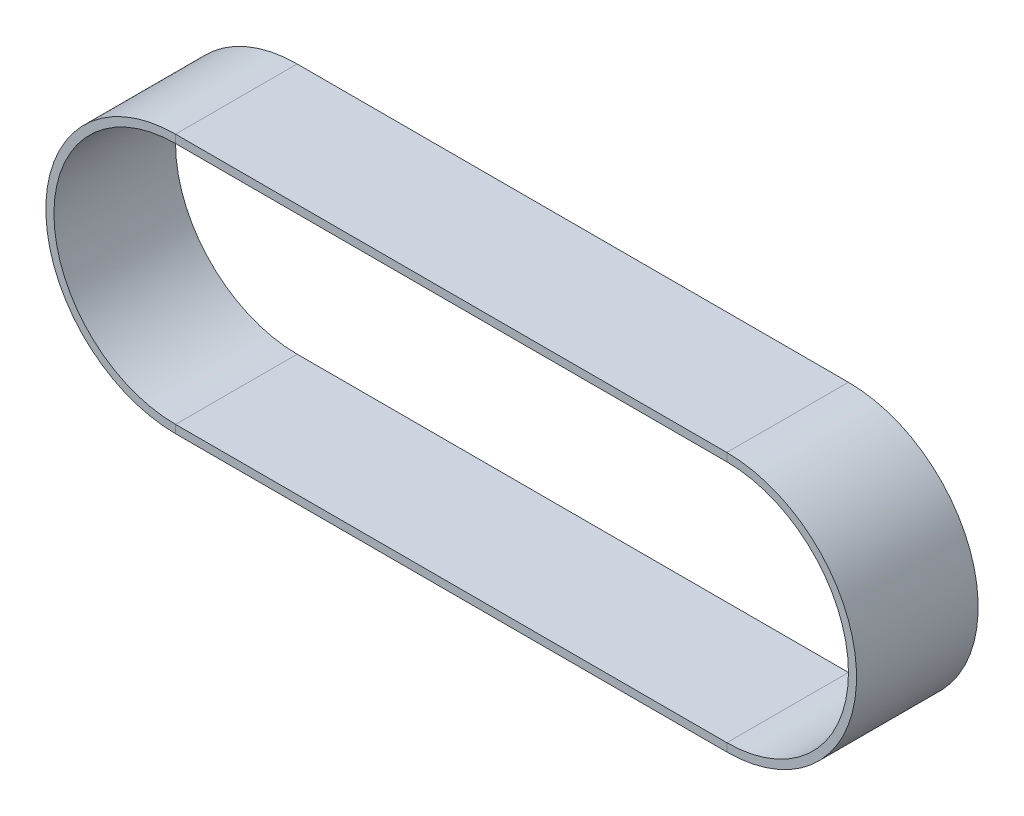
ISO-10303-21;
HEADER;
FILE_DESCRIPTION(('STEP AP214'),'2;1');
FILE_NAME('part.step','',(''),(''),'','','');
FILE_SCHEMA(('AUTOMOTIVE_DESIGN { 1 0 10303 214 1 1 1 1 }'));
ENDSEC;
DATA;
#1=APPLICATION_CONTEXT('core data for automotive mechanical design processes');
#2=APPLICATION_PROTOCOL_DEFINITION('international standard','automotive_design',2000,#1);
#3=PRODUCT_CONTEXT('',#1,'mechanical');
#4=PRODUCT('Part','Part','',(#3));
#5=PRODUCT_RELATED_PRODUCT_CATEGORY('part','',(#4));
#6=PRODUCT_DEFINITION_FORMATION('','',#4);
#7=PRODUCT_DEFINITION_CONTEXT('part definition',#1,'design');
#8=PRODUCT_DEFINITION('design','',#6,#7);
#9=PRODUCT_DEFINITION_SHAPE('','',#8);
#10=(LENGTH_UNIT() NAMED_UNIT(*) SI_UNIT(.MILLI.,.METRE.));
#11=(NAMED_UNIT(*) PLANE_ANGLE_UNIT() SI_UNIT($,.RADIAN.));
#12=(NAMED_UNIT(*) SI_UNIT($,.STERADIAN.) SOLID_ANGLE_UNIT());
#13=UNCERTAINTY_MEASURE_WITH_UNIT(LENGTH_MEASURE(1.E-05),#10,'distance_accuracy_value','');
#14=(GEOMETRIC_REPRESENTATION_CONTEXT(3) GLOBAL_UNCERTAINTY_ASSIGNED_CONTEXT((#13)) GLOBAL_UNIT_ASSIGNED_CONTEXT((#10,
#11,#12)) REPRESENTATION_CONTEXT('',''));
#15=CARTESIAN_POINT('',(0.,0.,0.));
#16=DIRECTION('',(0.,0.,1.));
#17=DIRECTION('',(1.,0.,0.));
#18=AXIS2_PLACEMENT_3D('',#15,#16,#17);
#19=CARTESIAN_POINT('',(-1360.,320.,150.));
#20=DIRECTION('',(0.,1.,0.));
#21=DIRECTION('',(0.,0.,1.));
#22=AXIS2_PLACEMENT_3D('',#19,#20,#21);
#23=PLANE('',#22);
#24=DIRECTION('',(1.,0.,0.));
#25=VECTOR('',#24,1.);
#26=CARTESIAN_POINT('',(-1360.,320.,-150.));
#27=LINE('',#26,#25);
#28=CARTESIAN_POINT('',(-1360.,320.,-150.));
#29=VERTEX_POINT('',#28);
#30=CARTESIAN_POINT('',(0.,320.,-150.));
#31=VERTEX_POINT('',#30);
#32=EDGE_CURVE('E11',#29,#31,#27,.T.);
#33=ORIENTED_EDGE('',*,*,#32,.F.);
#34=DIRECTION('',(0.,0.,1.));
#35=VECTOR('',#34,1.);
#36=CARTESIAN_POINT('',(-1360.,320.,150.));
#37=LINE('',#36,#35);
#38=CARTESIAN_POINT('',(-1360.,320.,150.));
#39=VERTEX_POINT('',#38);
#40=EDGE_CURVE('E38',#29,#39,#37,.T.);
#41=ORIENTED_EDGE('',*,*,#40,.T.);
#42=DIRECTION('',(1.,0.,0.));
#43=VECTOR('',#42,1.);
#44=CARTESIAN_POINT('',(-1360.,320.,150.));
#45=LINE('',#44,#43);
#46=CARTESIAN_POINT('',(0.,320.,150.));
#47=VERTEX_POINT('',#46);
#48=EDGE_CURVE('E123',#39,#47,#45,.T.);
#49=ORIENTED_EDGE('',*,*,#48,.T.);
#50=DIRECTION('',(0.,0.,1.));
#51=VECTOR('',#50,1.);
#52=CARTESIAN_POINT('',(0.,320.,150.));
#53=LINE('',#52,#51);
#54=EDGE_CURVE('E126',#31,#47,#53,.T.);
#55=ORIENTED_EDGE('',*,*,#54,.F.);
#56=EDGE_LOOP('',(#33,#41,#49,#55));
#57=FACE_BOUND('',#56,.T.);
#58=ADVANCED_FACE('F35',(#57),#23,.T.);
#59=CARTESIAN_POINT('',(-1360.,320.,-150.));
#60=DIRECTION('',(0.,0.,-1.));
#61=DIRECTION('',(-1.,0.,0.));
#62=AXIS2_PLACEMENT_3D('',#59,#60,#61);
#63=PLANE('',#62);
#64=DIRECTION('',(1.,0.,0.));
#65=VECTOR('',#64,1.);
#66=CARTESIAN_POINT('',(-1360.,300.,-150.));
#67=LINE('',#66,#65);
#68=CARTESIAN_POINT('',(-1360.,300.,-150.));
#69=VERTEX_POINT('',#68);
#70=CARTESIAN_POINT('',(0.,300.,-150.));
#71=VERTEX_POINT('',#70);
#72=EDGE_CURVE('E43',#69,#71,#67,.T.);
#73=ORIENTED_EDGE('',*,*,#72,.F.);
#74=DIRECTION('',(0.,1.,0.));
#75=VECTOR('',#74,1.);
#76=CARTESIAN_POINT('',(-1360.,320.,-150.));
#77=LINE('',#76,#75);
#78=EDGE_CURVE('E193',#69,#29,#77,.T.);
#79=ORIENTED_EDGE('',*,*,#78,.T.);
#80=ORIENTED_EDGE('',*,*,#32,.T.);
#81=DIRECTION('',(0.,1.,0.));
#82=VECTOR('',#81,1.);
#83=CARTESIAN_POINT('',(0.,320.,-150.));
#84=LINE('',#83,#82);
#85=EDGE_CURVE('E151',#71,#31,#84,.T.);
#86=ORIENTED_EDGE('',*,*,#85,.F.);
#87=EDGE_LOOP('',(#73,#79,#80,#86));
#88=FACE_BOUND('',#87,.T.);
#89=ADVANCED_FACE('F217',(#88),#63,.T.);
#90=CARTESIAN_POINT('',(-1360.,300.,150.));
#91=DIRECTION('',(0.,-1.,0.));
#92=DIRECTION('',(0.,0.,-1.));
#93=AXIS2_PLACEMENT_3D('',#90,#91,#92);
#94=PLANE('',#93);
#95=DIRECTION('',(1.,0.,0.));
#96=VECTOR('',#95,1.);
#97=CARTESIAN_POINT('',(-1360.,300.,150.));
#98=LINE('',#97,#96);
#99=CARTESIAN_POINT('',(-1360.,300.,150.));
#100=VERTEX_POINT('',#99);
#101=CARTESIAN_POINT('',(0.,300.,150.));
#102=VERTEX_POINT('',#101);
#103=EDGE_CURVE('E132',#100,#102,#98,.T.);
#104=ORIENTED_EDGE('',*,*,#103,.F.);
#105=DIRECTION('',(0.,0.,-1.));
#106=VECTOR('',#105,1.);
#107=CARTESIAN_POINT('',(-1360.,300.,150.));
#108=LINE('',#107,#106);
#109=EDGE_CURVE('E177',#100,#69,#108,.T.);
#110=ORIENTED_EDGE('',*,*,#109,.T.);
#111=ORIENTED_EDGE('',*,*,#72,.T.);
#112=DIRECTION('',(0.,0.,-1.));
#113=VECTOR('',#112,1.);
#114=CARTESIAN_POINT('',(0.,300.,150.));
#115=LINE('',#114,#113);
#116=EDGE_CURVE('E155',#102,#71,#115,.T.);
#117=ORIENTED_EDGE('',*,*,#116,.F.);
#118=EDGE_LOOP('',(#104,#110,#111,#117));
#119=FACE_BOUND('',#118,.T.);
#120=ADVANCED_FACE('F222',(#119),#94,.T.);
#121=CARTESIAN_POINT('',(-1360.,0.,0.));
#122=DIRECTION('',(0.,0.,-1.));
#123=DIRECTION('',(-1.,0.,0.));
#124=AXIS2_PLACEMENT_3D('',#121,#122,#123);
#125=CYLINDRICAL_SURFACE('',#124,320.);
#126=ORIENTED_EDGE('',*,*,#40,.F.);
#127=CARTESIAN_POINT('',(-1360.,0.,-150.));
#128=DIRECTION('',(0.,0.,-1.));
#129=DIRECTION('',(0.,-1.,0.));
#130=AXIS2_PLACEMENT_3D('',#127,#128,#129);
#131=CIRCLE('',#130,320.);
#132=CARTESIAN_POINT('',(-1360.,-320.,-150.));
#133=VERTEX_POINT('',#132);
#134=EDGE_CURVE('E79',#133,#29,#131,.T.);
#135=ORIENTED_EDGE('',*,*,#134,.F.);
#136=DIRECTION('',(0.,0.,1.));
#137=VECTOR('',#136,1.);
#138=CARTESIAN_POINT('',(-1360.,-320.,150.));
#139=LINE('',#138,#137);
#140=CARTESIAN_POINT('',(-1360.,-320.,150.));
#141=VERTEX_POINT('',#140);
#142=EDGE_CURVE('E180',#133,#141,#139,.T.);
#143=ORIENTED_EDGE('',*,*,#142,.T.);
#144=CARTESIAN_POINT('',(-1360.,0.,150.));
#145=DIRECTION('',(0.,0.,-1.));
#146=DIRECTION('',(0.,-1.,0.));
#147=AXIS2_PLACEMENT_3D('',#144,#145,#146);
#148=CIRCLE('',#147,320.);
#149=EDGE_CURVE('E175',#141,#39,#148,.T.);
#150=ORIENTED_EDGE('',*,*,#149,.T.);
#151=EDGE_LOOP('',(#126,#135,#143,#150));
#152=FACE_BOUND('',#151,.T.);
#153=ADVANCED_FACE('F206',(#152),#125,.T.);
#154=CARTESIAN_POINT('',(-1360.,-320.,-150.));
#155=DIRECTION('',(0.,0.,-1.));
#156=DIRECTION('',(-1.,0.,0.));
#157=AXIS2_PLACEMENT_3D('',#154,#155,#156);
#158=PLANE('',#157);
#159=ORIENTED_EDGE('',*,*,#134,.T.);
#160=ORIENTED_EDGE('',*,*,#78,.F.);
#161=CARTESIAN_POINT('',(-1360.,0.,-150.));
#162=DIRECTION('',(0.,0.,-1.));
#163=DIRECTION('',(0.,-1.,0.));
#164=AXIS2_PLACEMENT_3D('',#161,#162,#163);
#165=CIRCLE('',#164,300.);
#166=CARTESIAN_POINT('',(-1360.,-300.,-150.));
#167=VERTEX_POINT('',#166);
#168=EDGE_CURVE('E88',#167,#69,#165,.T.);
#169=ORIENTED_EDGE('',*,*,#168,.F.);
#170=DIRECTION('',(0.,-1.,0.));
#171=VECTOR('',#170,1.);
#172=CARTESIAN_POINT('',(-1360.,-320.,-150.));
#173=LINE('',#172,#171);
#174=EDGE_CURVE('E189',#167,#133,#173,.T.);
#175=ORIENTED_EDGE('',*,*,#174,.T.);
#176=EDGE_LOOP('',(#159,#160,#169,#175));
#177=FACE_BOUND('',#176,.T.);
#178=ADVANCED_FACE('F216',(#177),#158,.T.);
#179=CARTESIAN_POINT('',(-1360.,0.,0.));
#180=DIRECTION('',(0.,0.,-1.));
#181=DIRECTION('',(-1.,0.,0.));
#182=AXIS2_PLACEMENT_3D('',#179,#180,#181);
#183=CYLINDRICAL_SURFACE('',#182,300.);
#184=ORIENTED_EDGE('',*,*,#168,.T.);
#185=ORIENTED_EDGE('',*,*,#109,.F.);
#186=CARTESIAN_POINT('',(-1360.,0.,150.));
#187=DIRECTION('',(0.,0.,-1.));
#188=DIRECTION('',(0.,-1.,0.));
#189=AXIS2_PLACEMENT_3D('',#186,#187,#188);
#190=CIRCLE('',#189,300.);
#191=CARTESIAN_POINT('',(-1360.,-300.,150.));
#192=VERTEX_POINT('',#191);
#193=EDGE_CURVE('E96',#192,#100,#190,.T.);
#194=ORIENTED_EDGE('',*,*,#193,.F.);
#195=DIRECTION('',(0.,0.,-1.));
#196=VECTOR('',#195,1.);
#197=CARTESIAN_POINT('',(-1360.,-300.,150.));
#198=LINE('',#197,#196);
#199=EDGE_CURVE('E169',#192,#167,#198,.T.);
#200=ORIENTED_EDGE('',*,*,#199,.T.);
#201=EDGE_LOOP('',(#184,#185,#194,#200));
#202=FACE_BOUND('',#201,.T.);
#203=ADVANCED_FACE('F223',(#202),#183,.F.);
#204=CARTESIAN_POINT('',(-1360.,-320.,150.));
#205=DIRECTION('',(0.,0.,1.));
#206=DIRECTION('',(1.,0.,0.));
#207=AXIS2_PLACEMENT_3D('',#204,#205,#206);
#208=PLANE('',#207);
#209=ORIENTED_EDGE('',*,*,#193,.T.);
#210=DIRECTION('',(0.,-1.,0.));
#211=VECTOR('',#210,1.);
#212=CARTESIAN_POINT('',(-1360.,320.,150.));
#213=LINE('',#212,#211);
#214=EDGE_CURVE('E173',#39,#100,#213,.T.);
#215=ORIENTED_EDGE('',*,*,#214,.F.);
#216=ORIENTED_EDGE('',*,*,#149,.F.);
#217=DIRECTION('',(0.,1.,0.));
#218=VECTOR('',#217,1.);
#219=CARTESIAN_POINT('',(-1360.,-320.,150.));
#220=LINE('',#219,#218);
#221=EDGE_CURVE('E164',#141,#192,#220,.T.);
#222=ORIENTED_EDGE('',*,*,#221,.T.);
#223=EDGE_LOOP('',(#209,#215,#216,#222));
#224=FACE_BOUND('',#223,.T.);
#225=ADVANCED_FACE('F224',(#224),#208,.T.);
#226=CARTESIAN_POINT('',(0.,-320.,150.));
#227=DIRECTION('',(0.,-1.,0.));
#228=DIRECTION('',(0.,0.,-1.));
#229=AXIS2_PLACEMENT_3D('',#226,#227,#228);
#230=PLANE('',#229);
#231=ORIENTED_EDGE('',*,*,#142,.F.);
#232=DIRECTION('',(-1.,0.,0.));
#233=VECTOR('',#232,1.);
#234=CARTESIAN_POINT('',(0.,-320.,-150.));
#235=LINE('',#234,#233);
#236=CARTESIAN_POINT('',(0.,-320.,-150.));
#237=VERTEX_POINT('',#236);
#238=EDGE_CURVE('E199',#237,#133,#235,.T.);
#239=ORIENTED_EDGE('',*,*,#238,.F.);
#240=DIRECTION('',(0.,0.,1.));
#241=VECTOR('',#240,1.);
#242=CARTESIAN_POINT('',(0.,-320.,150.));
#243=LINE('',#242,#241);
#244=CARTESIAN_POINT('',(0.,-320.,150.));
#245=VERTEX_POINT('',#244);
#246=EDGE_CURVE('E172',#237,#245,#243,.T.);
#247=ORIENTED_EDGE('',*,*,#246,.T.);
#248=DIRECTION('',(-1.,0.,0.));
#249=VECTOR('',#248,1.);
#250=CARTESIAN_POINT('',(0.,-320.,150.));
#251=LINE('',#250,#249);
#252=EDGE_CURVE('E167',#245,#141,#251,.T.);
#253=ORIENTED_EDGE('',*,*,#252,.T.);
#254=EDGE_LOOP('',(#231,#239,#247,#253));
#255=FACE_BOUND('',#254,.T.);
#256=ADVANCED_FACE('F211',(#255),#230,.T.);
#257=CARTESIAN_POINT('',(0.,-320.,-150.));
#258=DIRECTION('',(0.,0.,-1.));
#259=DIRECTION('',(-1.,0.,0.));
#260=AXIS2_PLACEMENT_3D('',#257,#258,#259);
#261=PLANE('',#260);
#262=ORIENTED_EDGE('',*,*,#238,.T.);
#263=ORIENTED_EDGE('',*,*,#174,.F.);
#264=DIRECTION('',(-1.,0.,0.));
#265=VECTOR('',#264,1.);
#266=CARTESIAN_POINT('',(0.,-300.,-150.));
#267=LINE('',#266,#265);
#268=CARTESIAN_POINT('',(0.,-300.,-150.));
#269=VERTEX_POINT('',#268);
#270=EDGE_CURVE('E108',#269,#167,#267,.T.);
#271=ORIENTED_EDGE('',*,*,#270,.F.);
#272=DIRECTION('',(0.,-1.,0.));
#273=VECTOR('',#272,1.);
#274=CARTESIAN_POINT('',(0.,-320.,-150.));
#275=LINE('',#274,#273);
#276=EDGE_CURVE('E186',#269,#237,#275,.T.);
#277=ORIENTED_EDGE('',*,*,#276,.T.);
#278=EDGE_LOOP('',(#262,#263,#271,#277));
#279=FACE_BOUND('',#278,.T.);
#280=ADVANCED_FACE('F215',(#279),#261,.T.);
#281=CARTESIAN_POINT('',(0.,-300.,150.));
#282=DIRECTION('',(0.,1.,0.));
#283=DIRECTION('',(0.,0.,1.));
#284=AXIS2_PLACEMENT_3D('',#281,#282,#283);
#285=PLANE('',#284);
#286=ORIENTED_EDGE('',*,*,#270,.T.);
#287=ORIENTED_EDGE('',*,*,#199,.F.);
#288=DIRECTION('',(-1.,0.,0.));
#289=VECTOR('',#288,1.);
#290=CARTESIAN_POINT('',(0.,-300.,150.));
#291=LINE('',#290,#289);
#292=CARTESIAN_POINT('',(0.,-300.,150.));
#293=VERTEX_POINT('',#292);
#294=EDGE_CURVE('E114',#293,#192,#291,.T.);
#295=ORIENTED_EDGE('',*,*,#294,.F.);
#296=DIRECTION('',(0.,0.,-1.));
#297=VECTOR('',#296,1.);
#298=CARTESIAN_POINT('',(0.,-300.,150.));
#299=LINE('',#298,#297);
#300=EDGE_CURVE('E162',#293,#269,#299,.T.);
#301=ORIENTED_EDGE('',*,*,#300,.T.);
#302=EDGE_LOOP('',(#286,#287,#295,#301));
#303=FACE_BOUND('',#302,.T.);
#304=ADVANCED_FACE('F277',(#303),#285,.T.);
#305=CARTESIAN_POINT('',(0.,-320.,150.));
#306=DIRECTION('',(0.,0.,1.));
#307=DIRECTION('',(1.,0.,0.));
#308=AXIS2_PLACEMENT_3D('',#305,#306,#307);
#309=PLANE('',#308);
#310=ORIENTED_EDGE('',*,*,#294,.T.);
#311=ORIENTED_EDGE('',*,*,#221,.F.);
#312=ORIENTED_EDGE('',*,*,#252,.F.);
#313=DIRECTION('',(0.,1.,0.));
#314=VECTOR('',#313,1.);
#315=CARTESIAN_POINT('',(0.,-320.,150.));
#316=LINE('',#315,#314);
#317=EDGE_CURVE('E143',#245,#293,#316,.T.);
#318=ORIENTED_EDGE('',*,*,#317,.T.);
#319=EDGE_LOOP('',(#310,#311,#312,#318));
#320=FACE_BOUND('',#319,.T.);
#321=ADVANCED_FACE('F209',(#320),#309,.T.);
#322=CARTESIAN_POINT('',(0.,0.,0.));
#323=DIRECTION('',(0.,0.,-1.));
#324=DIRECTION('',(-1.,0.,0.));
#325=AXIS2_PLACEMENT_3D('',#322,#323,#324);
#326=CYLINDRICAL_SURFACE('',#325,320.);
#327=ORIENTED_EDGE('',*,*,#246,.F.);
#328=CARTESIAN_POINT('',(0.,0.,-150.));
#329=DIRECTION('',(0.,0.,-1.));
#330=DIRECTION('',(0.,1.,0.));
#331=AXIS2_PLACEMENT_3D('',#328,#329,#330);
#332=CIRCLE('',#331,320.);
#333=EDGE_CURVE('E150',#31,#237,#332,.T.);
#334=ORIENTED_EDGE('',*,*,#333,.F.);
#335=ORIENTED_EDGE('',*,*,#54,.T.);
#336=CARTESIAN_POINT('',(0.,0.,150.));
#337=DIRECTION('',(0.,0.,-1.));
#338=DIRECTION('',(0.,1.,0.));
#339=AXIS2_PLACEMENT_3D('',#336,#337,#338);
#340=CIRCLE('',#339,320.);
#341=EDGE_CURVE('E138',#47,#245,#340,.T.);
#342=ORIENTED_EDGE('',*,*,#341,.T.);
#343=EDGE_LOOP('',(#327,#334,#335,#342));
#344=FACE_BOUND('',#343,.T.);
#345=ADVANCED_FACE('F148',(#344),#326,.T.);
#346=CARTESIAN_POINT('',(0.,320.,-150.));
#347=DIRECTION('',(0.,0.,-1.));
#348=DIRECTION('',(-1.,0.,0.));
#349=AXIS2_PLACEMENT_3D('',#346,#347,#348);
#350=PLANE('',#349);
#351=ORIENTED_EDGE('',*,*,#333,.T.);
#352=ORIENTED_EDGE('',*,*,#276,.F.);
#353=CARTESIAN_POINT('',(0.,0.,-150.));
#354=DIRECTION('',(0.,0.,-1.));
#355=DIRECTION('',(0.,1.,0.));
#356=AXIS2_PLACEMENT_3D('',#353,#354,#355);
#357=CIRCLE('',#356,300.);
#358=EDGE_CURVE('E183',#71,#269,#357,.T.);
#359=ORIENTED_EDGE('',*,*,#358,.F.);
#360=ORIENTED_EDGE('',*,*,#85,.T.);
#361=EDGE_LOOP('',(#351,#352,#359,#360));
#362=FACE_BOUND('',#361,.T.);
#363=ADVANCED_FACE('F213',(#362),#350,.T.);
#364=CARTESIAN_POINT('',(0.,0.,0.));
#365=DIRECTION('',(0.,0.,-1.));
#366=DIRECTION('',(-1.,0.,0.));
#367=AXIS2_PLACEMENT_3D('',#364,#365,#366);
#368=CYLINDRICAL_SURFACE('',#367,300.);
#369=ORIENTED_EDGE('',*,*,#358,.T.);
#370=ORIENTED_EDGE('',*,*,#300,.F.);
#371=CARTESIAN_POINT('',(0.,0.,150.));
#372=DIRECTION('',(0.,0.,-1.));
#373=DIRECTION('',(0.,1.,0.));
#374=AXIS2_PLACEMENT_3D('',#371,#372,#373);
#375=CIRCLE('',#374,300.);
#376=EDGE_CURVE('E161',#102,#293,#375,.T.);
#377=ORIENTED_EDGE('',*,*,#376,.F.);
#378=ORIENTED_EDGE('',*,*,#116,.T.);
#379=EDGE_LOOP('',(#369,#370,#377,#378));
#380=FACE_BOUND('',#379,.T.);
#381=ADVANCED_FACE('F220',(#380),#368,.F.);
#382=CARTESIAN_POINT('',(0.,320.,150.));
#383=DIRECTION('',(0.,0.,1.));
#384=DIRECTION('',(1.,0.,0.));
#385=AXIS2_PLACEMENT_3D('',#382,#383,#384);
#386=PLANE('',#385);
#387=ORIENTED_EDGE('',*,*,#376,.T.);
#388=ORIENTED_EDGE('',*,*,#317,.F.);
#389=ORIENTED_EDGE('',*,*,#341,.F.);
#390=DIRECTION('',(0.,-1.,0.));
#391=VECTOR('',#390,1.);
#392=CARTESIAN_POINT('',(0.,320.,150.));
#393=LINE('',#392,#391);
#394=EDGE_CURVE('E141',#47,#102,#393,.T.);
#395=ORIENTED_EDGE('',*,*,#394,.T.);
#396=EDGE_LOOP('',(#387,#388,#389,#395));
#397=FACE_BOUND('',#396,.T.);
#398=ADVANCED_FACE('F140',(#397),#386,.T.);
#399=CARTESIAN_POINT('',(-1360.,320.,150.));
#400=DIRECTION('',(0.,0.,1.));
#401=DIRECTION('',(1.,0.,0.));
#402=AXIS2_PLACEMENT_3D('',#399,#400,#401);
#403=PLANE('',#402);
#404=ORIENTED_EDGE('',*,*,#214,.T.);
#405=ORIENTED_EDGE('',*,*,#103,.T.);
#406=ORIENTED_EDGE('',*,*,#394,.F.);
#407=ORIENTED_EDGE('',*,*,#48,.F.);
#408=EDGE_LOOP('',(#404,#405,#406,#407));
#409=FACE_BOUND('',#408,.T.);
#410=ADVANCED_FACE('F153',(#409),#403,.T.);
#411=CLOSED_SHELL('',(#58,#89,#120,#153,#178,#203,#225,#256,#280,#304,#321,#345,#363,#381,#398,#410));
#412=MANIFOLD_SOLID_BREP('B2',#411);
#413=ADVANCED_BREP_SHAPE_REPRESENTATION('',(#18,#412),#14);
#414=SHAPE_DEFINITION_REPRESENTATION(#9,#413);
ENDSEC;
END-ISO-10303-21;
